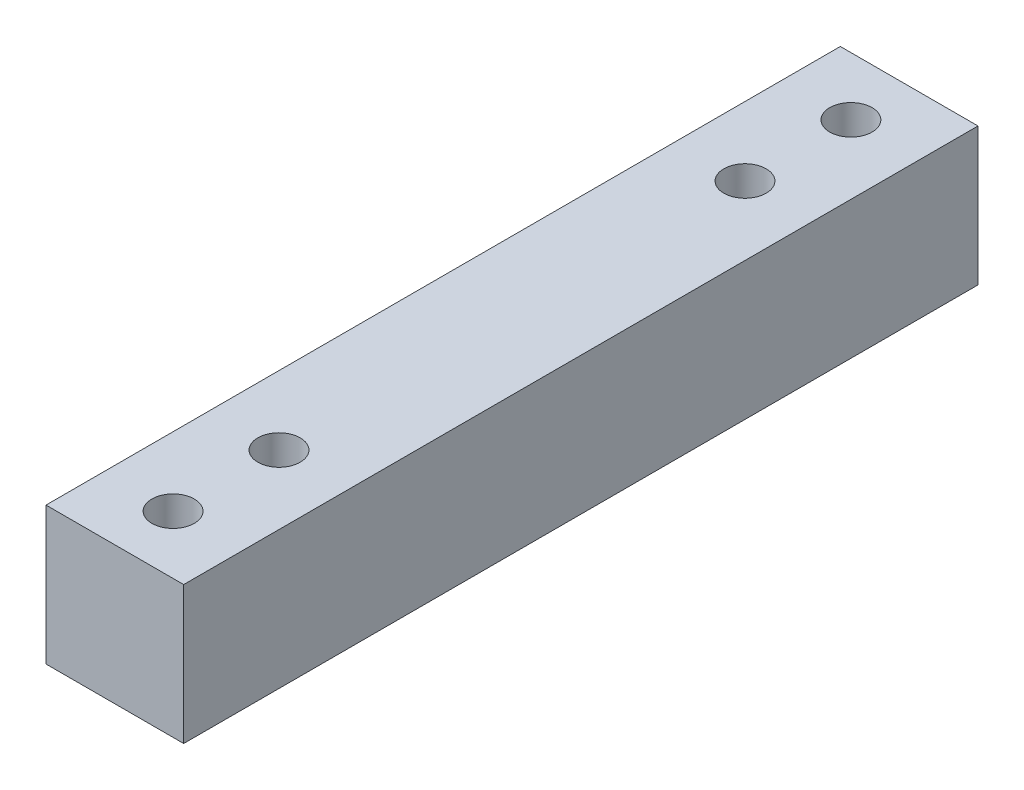
ISO-10303-21;
HEADER;
FILE_DESCRIPTION(('STEP AP214'),'2;1');
FILE_NAME('part.step','',(''),(''),'','','');
FILE_SCHEMA(('AUTOMOTIVE_DESIGN { 1 0 10303 214 1 1 1 1 }'));
ENDSEC;
DATA;
#1=APPLICATION_CONTEXT('core data for automotive mechanical design processes');
#2=APPLICATION_PROTOCOL_DEFINITION('international standard','automotive_design',2000,#1);
#3=PRODUCT_CONTEXT('',#1,'mechanical');
#4=PRODUCT('Part','Part','',(#3));
#5=PRODUCT_RELATED_PRODUCT_CATEGORY('part','',(#4));
#6=PRODUCT_DEFINITION_FORMATION('','',#4);
#7=PRODUCT_DEFINITION_CONTEXT('part definition',#1,'design');
#8=PRODUCT_DEFINITION('design','',#6,#7);
#9=PRODUCT_DEFINITION_SHAPE('','',#8);
#10=(LENGTH_UNIT() NAMED_UNIT(*) SI_UNIT(.MILLI.,.METRE.));
#11=(NAMED_UNIT(*) PLANE_ANGLE_UNIT() SI_UNIT($,.RADIAN.));
#12=(NAMED_UNIT(*) SI_UNIT($,.STERADIAN.) SOLID_ANGLE_UNIT());
#13=UNCERTAINTY_MEASURE_WITH_UNIT(LENGTH_MEASURE(1.E-05),#10,'distance_accuracy_value','');
#14=(GEOMETRIC_REPRESENTATION_CONTEXT(3) GLOBAL_UNCERTAINTY_ASSIGNED_CONTEXT((#13)) GLOBAL_UNIT_ASSIGNED_CONTEXT((#10,
#11,#12)) REPRESENTATION_CONTEXT('',''));
#15=CARTESIAN_POINT('',(0.,0.,0.));
#16=DIRECTION('',(0.,0.,1.));
#17=DIRECTION('',(1.,0.,0.));
#18=AXIS2_PLACEMENT_3D('',#15,#16,#17);
#19=CARTESIAN_POINT('',(6.5,-6.5,75.));
#20=DIRECTION('',(-1.,0.,0.));
#21=DIRECTION('',(0.,0.,1.));
#22=AXIS2_PLACEMENT_3D('',#19,#20,#21);
#23=PLANE('',#22);
#24=DIRECTION('',(0.,1.,0.));
#25=VECTOR('',#24,1.);
#26=CARTESIAN_POINT('',(6.5,-6.5,0.));
#27=LINE('',#26,#25);
#28=CARTESIAN_POINT('',(6.5,-6.5,0.));
#29=VERTEX_POINT('',#28);
#30=CARTESIAN_POINT('',(6.5,6.5,0.));
#31=VERTEX_POINT('',#30);
#32=EDGE_CURVE('E114',#29,#31,#27,.T.);
#33=ORIENTED_EDGE('',*,*,#32,.T.);
#34=DIRECTION('',(0.,0.,-1.));
#35=VECTOR('',#34,1.);
#36=CARTESIAN_POINT('',(6.5,6.5,75.));
#37=LINE('',#36,#35);
#38=CARTESIAN_POINT('',(6.5,6.5,75.));
#39=VERTEX_POINT('',#38);
#40=EDGE_CURVE('E11',#39,#31,#37,.T.);
#41=ORIENTED_EDGE('',*,*,#40,.F.);
#42=DIRECTION('',(0.,1.,0.));
#43=VECTOR('',#42,1.);
#44=CARTESIAN_POINT('',(6.5,-6.5,75.));
#45=LINE('',#44,#43);
#46=CARTESIAN_POINT('',(6.5,-6.5,75.));
#47=VERTEX_POINT('',#46);
#48=EDGE_CURVE('E97',#47,#39,#45,.T.);
#49=ORIENTED_EDGE('',*,*,#48,.F.);
#50=DIRECTION('',(0.,0.,-1.));
#51=VECTOR('',#50,1.);
#52=CARTESIAN_POINT('',(6.5,-6.5,75.));
#53=LINE('',#52,#51);
#54=EDGE_CURVE('E110',#47,#29,#53,.T.);
#55=ORIENTED_EDGE('',*,*,#54,.T.);
#56=EDGE_LOOP('',(#33,#41,#49,#55));
#57=FACE_BOUND('',#56,.T.);
#58=ADVANCED_FACE('F43',(#57),#23,.F.);
#59=CARTESIAN_POINT('',(-6.5,6.5,75.));
#60=DIRECTION('',(0.,-1.,0.));
#61=DIRECTION('',(0.,0.,-1.));
#62=AXIS2_PLACEMENT_3D('',#59,#60,#61);
#63=PLANE('',#62);
#64=CARTESIAN_POINT('',(0.,6.5,69.5));
#65=DIRECTION('',(0.,1.,0.));
#66=DIRECTION('',(0.,0.,1.));
#67=AXIS2_PLACEMENT_3D('',#64,#65,#66);
#68=CIRCLE('',#67,2.);
#69=CARTESIAN_POINT('',(0.,6.5,71.5));
#70=VERTEX_POINT('',#69);
#71=EDGE_CURVE('E133',#70,#70,#68,.T.);
#72=ORIENTED_EDGE('',*,*,#71,.F.);
#73=EDGE_LOOP('',(#72));
#74=FACE_BOUND('',#73,.T.);
#75=CARTESIAN_POINT('',(0.,6.5,15.5));
#76=DIRECTION('',(0.,1.,0.));
#77=DIRECTION('',(0.,0.,-1.));
#78=AXIS2_PLACEMENT_3D('',#75,#76,#77);
#79=CIRCLE('',#78,2.);
#80=CARTESIAN_POINT('',(0.,6.5,13.5));
#81=VERTEX_POINT('',#80);
#82=EDGE_CURVE('E269',#81,#81,#79,.T.);
#83=ORIENTED_EDGE('',*,*,#82,.F.);
#84=EDGE_LOOP('',(#83));
#85=FACE_BOUND('',#84,.T.);
#86=CARTESIAN_POINT('',(0.,6.5,5.50000000000001));
#87=DIRECTION('',(0.,1.,0.));
#88=DIRECTION('',(0.,0.,-1.));
#89=AXIS2_PLACEMENT_3D('',#86,#87,#88);
#90=CIRCLE('',#89,2.);
#91=CARTESIAN_POINT('',(0.,6.5,3.5));
#92=VERTEX_POINT('',#91);
#93=EDGE_CURVE('E260',#92,#92,#90,.T.);
#94=ORIENTED_EDGE('',*,*,#93,.F.);
#95=EDGE_LOOP('',(#94));
#96=FACE_BOUND('',#95,.T.);
#97=CARTESIAN_POINT('',(0.,6.5,59.5));
#98=DIRECTION('',(0.,1.,0.));
#99=DIRECTION('',(0.,0.,1.));
#100=AXIS2_PLACEMENT_3D('',#97,#98,#99);
#101=CIRCLE('',#100,2.);
#102=CARTESIAN_POINT('',(0.,6.5,61.5));
#103=VERTEX_POINT('',#102);
#104=EDGE_CURVE('E268',#103,#103,#101,.T.);
#105=ORIENTED_EDGE('',*,*,#104,.F.);
#106=EDGE_LOOP('',(#105));
#107=FACE_BOUND('',#106,.T.);
#108=DIRECTION('',(-1.,0.,0.));
#109=VECTOR('',#108,1.);
#110=CARTESIAN_POINT('',(-6.5,6.5,0.));
#111=LINE('',#110,#109);
#112=CARTESIAN_POINT('',(-6.5,6.5,0.));
#113=VERTEX_POINT('',#112);
#114=EDGE_CURVE('E102',#31,#113,#111,.T.);
#115=ORIENTED_EDGE('',*,*,#114,.T.);
#116=DIRECTION('',(0.,0.,-1.));
#117=VECTOR('',#116,1.);
#118=CARTESIAN_POINT('',(-6.5,6.5,75.));
#119=LINE('',#118,#117);
#120=CARTESIAN_POINT('',(-6.5,6.5,75.));
#121=VERTEX_POINT('',#120);
#122=EDGE_CURVE('E53',#121,#113,#119,.T.);
#123=ORIENTED_EDGE('',*,*,#122,.F.);
#124=DIRECTION('',(-1.,0.,0.));
#125=VECTOR('',#124,1.);
#126=CARTESIAN_POINT('',(-6.5,6.5,75.));
#127=LINE('',#126,#125);
#128=EDGE_CURVE('E92',#39,#121,#127,.T.);
#129=ORIENTED_EDGE('',*,*,#128,.F.);
#130=ORIENTED_EDGE('',*,*,#40,.T.);
#131=EDGE_LOOP('',(#115,#123,#129,#130));
#132=FACE_BOUND('',#131,.T.);
#133=ADVANCED_FACE('F101',(#74,#85,#96,#107,#132),#63,.F.);
#134=CARTESIAN_POINT('',(-6.5,-6.5,75.));
#135=DIRECTION('',(1.,0.,0.));
#136=DIRECTION('',(0.,0.,-1.));
#137=AXIS2_PLACEMENT_3D('',#134,#135,#136);
#138=PLANE('',#137);
#139=DIRECTION('',(0.,-1.,0.));
#140=VECTOR('',#139,1.);
#141=CARTESIAN_POINT('',(-6.5,-6.5,0.));
#142=LINE('',#141,#140);
#143=CARTESIAN_POINT('',(-6.5,-6.5,0.));
#144=VERTEX_POINT('',#143);
#145=EDGE_CURVE('E79',#113,#144,#142,.T.);
#146=ORIENTED_EDGE('',*,*,#145,.T.);
#147=DIRECTION('',(0.,0.,-1.));
#148=VECTOR('',#147,1.);
#149=CARTESIAN_POINT('',(-6.5,-6.5,75.));
#150=LINE('',#149,#148);
#151=CARTESIAN_POINT('',(-6.5,-6.5,75.));
#152=VERTEX_POINT('',#151);
#153=EDGE_CURVE('E104',#152,#144,#150,.T.);
#154=ORIENTED_EDGE('',*,*,#153,.F.);
#155=DIRECTION('',(0.,-1.,0.));
#156=VECTOR('',#155,1.);
#157=CARTESIAN_POINT('',(-6.5,-6.5,75.));
#158=LINE('',#157,#156);
#159=EDGE_CURVE('E95',#121,#152,#158,.T.);
#160=ORIENTED_EDGE('',*,*,#159,.F.);
#161=ORIENTED_EDGE('',*,*,#122,.T.);
#162=EDGE_LOOP('',(#146,#154,#160,#161));
#163=FACE_BOUND('',#162,.T.);
#164=ADVANCED_FACE('F106',(#163),#138,.F.);
#165=CARTESIAN_POINT('',(-6.5,-6.5,75.));
#166=DIRECTION('',(0.,1.,0.));
#167=DIRECTION('',(0.,0.,1.));
#168=AXIS2_PLACEMENT_3D('',#165,#166,#167);
#169=PLANE('',#168);
#170=CARTESIAN_POINT('',(0.,-6.5,69.5));
#171=DIRECTION('',(0.,1.,0.));
#172=DIRECTION('',(0.,0.,1.));
#173=AXIS2_PLACEMENT_3D('',#170,#171,#172);
#174=CIRCLE('',#173,2.);
#175=CARTESIAN_POINT('',(0.,-6.5,71.5));
#176=VERTEX_POINT('',#175);
#177=EDGE_CURVE('E46',#176,#176,#174,.T.);
#178=ORIENTED_EDGE('',*,*,#177,.T.);
#179=EDGE_LOOP('',(#178));
#180=FACE_BOUND('',#179,.T.);
#181=CARTESIAN_POINT('',(0.,-6.5,15.5));
#182=DIRECTION('',(0.,1.,0.));
#183=DIRECTION('',(0.,0.,1.));
#184=AXIS2_PLACEMENT_3D('',#181,#182,#183);
#185=CIRCLE('',#184,2.);
#186=CARTESIAN_POINT('',(0.,-6.5,17.5));
#187=VERTEX_POINT('',#186);
#188=EDGE_CURVE('E136',#187,#187,#185,.T.);
#189=ORIENTED_EDGE('',*,*,#188,.T.);
#190=EDGE_LOOP('',(#189));
#191=FACE_BOUND('',#190,.T.);
#192=CARTESIAN_POINT('',(0.,-6.5,5.50000000000001));
#193=DIRECTION('',(0.,1.,0.));
#194=DIRECTION('',(0.,0.,1.));
#195=AXIS2_PLACEMENT_3D('',#192,#193,#194);
#196=CIRCLE('',#195,2.);
#197=CARTESIAN_POINT('',(0.,-6.5,7.50000000000001));
#198=VERTEX_POINT('',#197);
#199=EDGE_CURVE('E132',#198,#198,#196,.T.);
#200=ORIENTED_EDGE('',*,*,#199,.T.);
#201=EDGE_LOOP('',(#200));
#202=FACE_BOUND('',#201,.T.);
#203=CARTESIAN_POINT('',(0.,-6.5,59.5));
#204=DIRECTION('',(0.,1.,0.));
#205=DIRECTION('',(0.,0.,1.));
#206=AXIS2_PLACEMENT_3D('',#203,#204,#205);
#207=CIRCLE('',#206,2.);
#208=CARTESIAN_POINT('',(0.,-6.5,61.5));
#209=VERTEX_POINT('',#208);
#210=EDGE_CURVE('E128',#209,#209,#207,.T.);
#211=ORIENTED_EDGE('',*,*,#210,.T.);
#212=EDGE_LOOP('',(#211));
#213=FACE_BOUND('',#212,.T.);
#214=DIRECTION('',(1.,0.,0.));
#215=VECTOR('',#214,1.);
#216=CARTESIAN_POINT('',(-6.5,-6.5,0.));
#217=LINE('',#216,#215);
#218=EDGE_CURVE('E85',#144,#29,#217,.T.);
#219=ORIENTED_EDGE('',*,*,#218,.T.);
#220=ORIENTED_EDGE('',*,*,#54,.F.);
#221=DIRECTION('',(1.,0.,0.));
#222=VECTOR('',#221,1.);
#223=CARTESIAN_POINT('',(-6.5,-6.5,75.));
#224=LINE('',#223,#222);
#225=EDGE_CURVE('E62',#152,#47,#224,.T.);
#226=ORIENTED_EDGE('',*,*,#225,.F.);
#227=ORIENTED_EDGE('',*,*,#153,.T.);
#228=EDGE_LOOP('',(#219,#220,#226,#227));
#229=FACE_BOUND('',#228,.T.);
#230=ADVANCED_FACE('F145',(#180,#191,#202,#213,#229),#169,.F.);
#231=CARTESIAN_POINT('',(0.,0.,75.));
#232=DIRECTION('',(0.,0.,-1.));
#233=DIRECTION('',(-1.,0.,0.));
#234=AXIS2_PLACEMENT_3D('',#231,#232,#233);
#235=PLANE('',#234);
#236=ORIENTED_EDGE('',*,*,#48,.T.);
#237=ORIENTED_EDGE('',*,*,#128,.T.);
#238=ORIENTED_EDGE('',*,*,#159,.T.);
#239=ORIENTED_EDGE('',*,*,#225,.T.);
#240=EDGE_LOOP('',(#236,#237,#238,#239));
#241=FACE_BOUND('',#240,.T.);
#242=ADVANCED_FACE('F93',(#241),#235,.F.);
#243=CARTESIAN_POINT('',(0.,0.,0.));
#244=DIRECTION('',(0.,0.,-1.));
#245=DIRECTION('',(-1.,0.,0.));
#246=AXIS2_PLACEMENT_3D('',#243,#244,#245);
#247=PLANE('',#246);
#248=ORIENTED_EDGE('',*,*,#32,.F.);
#249=ORIENTED_EDGE('',*,*,#218,.F.);
#250=ORIENTED_EDGE('',*,*,#145,.F.);
#251=ORIENTED_EDGE('',*,*,#114,.F.);
#252=EDGE_LOOP('',(#248,#249,#250,#251));
#253=FACE_BOUND('',#252,.T.);
#254=ADVANCED_FACE('F167',(#253),#247,.T.);
#255=CARTESIAN_POINT('',(0.,-68.5,59.5));
#256=DIRECTION('',(0.,1.,0.));
#257=DIRECTION('',(0.,0.,1.));
#258=AXIS2_PLACEMENT_3D('',#255,#256,#257);
#259=CYLINDRICAL_SURFACE('',#258,2.);
#260=ORIENTED_EDGE('',*,*,#104,.T.);
#261=EDGE_LOOP('',(#260));
#262=FACE_BOUND('',#261,.T.);
#263=ORIENTED_EDGE('',*,*,#210,.F.);
#264=EDGE_LOOP('',(#263));
#265=FACE_BOUND('',#264,.T.);
#266=ADVANCED_FACE('F169',(#262,#265),#259,.F.);
#267=CARTESIAN_POINT('',(0.,-68.5,5.50000000000001));
#268=DIRECTION('',(0.,1.,0.));
#269=DIRECTION('',(0.,0.,1.));
#270=AXIS2_PLACEMENT_3D('',#267,#268,#269);
#271=CYLINDRICAL_SURFACE('',#270,2.);
#272=ORIENTED_EDGE('',*,*,#93,.T.);
#273=EDGE_LOOP('',(#272));
#274=FACE_BOUND('',#273,.T.);
#275=ORIENTED_EDGE('',*,*,#199,.F.);
#276=EDGE_LOOP('',(#275));
#277=FACE_BOUND('',#276,.T.);
#278=ADVANCED_FACE('F155',(#274,#277),#271,.F.);
#279=CARTESIAN_POINT('',(0.,-68.5,15.5));
#280=DIRECTION('',(0.,1.,0.));
#281=DIRECTION('',(0.,0.,1.));
#282=AXIS2_PLACEMENT_3D('',#279,#280,#281);
#283=CYLINDRICAL_SURFACE('',#282,2.);
#284=ORIENTED_EDGE('',*,*,#82,.T.);
#285=EDGE_LOOP('',(#284));
#286=FACE_BOUND('',#285,.T.);
#287=ORIENTED_EDGE('',*,*,#188,.F.);
#288=EDGE_LOOP('',(#287));
#289=FACE_BOUND('',#288,.T.);
#290=ADVANCED_FACE('F149',(#286,#289),#283,.F.);
#291=CARTESIAN_POINT('',(0.,-68.5,69.5));
#292=DIRECTION('',(0.,1.,0.));
#293=DIRECTION('',(0.,0.,1.));
#294=AXIS2_PLACEMENT_3D('',#291,#292,#293);
#295=CYLINDRICAL_SURFACE('',#294,2.);
#296=ORIENTED_EDGE('',*,*,#71,.T.);
#297=EDGE_LOOP('',(#296));
#298=FACE_BOUND('',#297,.T.);
#299=ORIENTED_EDGE('',*,*,#177,.F.);
#300=EDGE_LOOP('',(#299));
#301=FACE_BOUND('',#300,.T.);
#302=ADVANCED_FACE('F147',(#298,#301),#295,.F.);
#303=CLOSED_SHELL('',(#58,#133,#164,#230,#242,#254,#266,#278,#290,#302));
#304=MANIFOLD_SOLID_BREP('B2',#303);
#305=ADVANCED_BREP_SHAPE_REPRESENTATION('',(#18,#304),#14);
#306=SHAPE_DEFINITION_REPRESENTATION(#9,#305);
ENDSEC;
END-ISO-10303-21;
